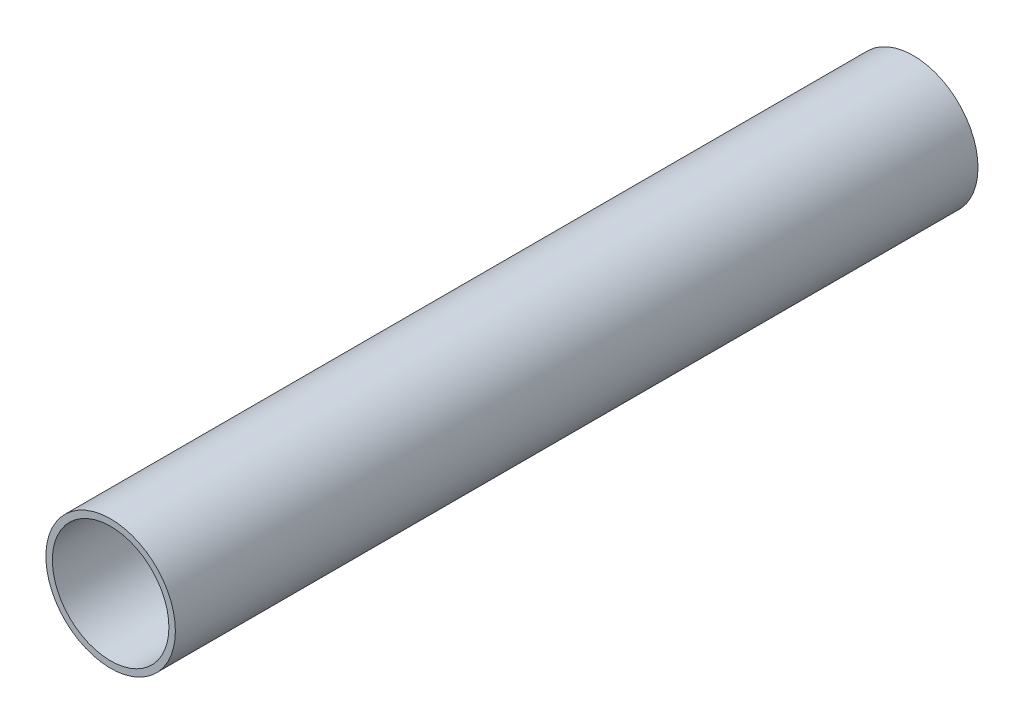
ISO-10303-21;
HEADER;
FILE_DESCRIPTION(('STEP AP214'),'2;1');
FILE_NAME('part.step','',(''),(''),'','','');
FILE_SCHEMA(('AUTOMOTIVE_DESIGN { 1 0 10303 214 1 1 1 1 }'));
ENDSEC;
DATA;
#1=APPLICATION_CONTEXT('core data for automotive mechanical design processes');
#2=APPLICATION_PROTOCOL_DEFINITION('international standard','automotive_design',2000,#1);
#3=PRODUCT_CONTEXT('',#1,'mechanical');
#4=PRODUCT('Part','Part','',(#3));
#5=PRODUCT_RELATED_PRODUCT_CATEGORY('part','',(#4));
#6=PRODUCT_DEFINITION_FORMATION('','',#4);
#7=PRODUCT_DEFINITION_CONTEXT('part definition',#1,'design');
#8=PRODUCT_DEFINITION('design','',#6,#7);
#9=PRODUCT_DEFINITION_SHAPE('','',#8);
#10=(LENGTH_UNIT() NAMED_UNIT(*) SI_UNIT(.MILLI.,.METRE.));
#11=(NAMED_UNIT(*) PLANE_ANGLE_UNIT() SI_UNIT($,.RADIAN.));
#12=(NAMED_UNIT(*) SI_UNIT($,.STERADIAN.) SOLID_ANGLE_UNIT());
#13=UNCERTAINTY_MEASURE_WITH_UNIT(LENGTH_MEASURE(1.E-05),#10,'distance_accuracy_value','');
#14=(GEOMETRIC_REPRESENTATION_CONTEXT(3) GLOBAL_UNCERTAINTY_ASSIGNED_CONTEXT((#13)) GLOBAL_UNIT_ASSIGNED_CONTEXT((#10,
#11,#12)) REPRESENTATION_CONTEXT('',''));
#15=CARTESIAN_POINT('',(0.,0.,0.));
#16=DIRECTION('',(0.,0.,1.));
#17=DIRECTION('',(1.,0.,0.));
#18=AXIS2_PLACEMENT_3D('',#15,#16,#17);
#19=CARTESIAN_POINT('',(0.,0.,15.24));
#20=DIRECTION('',(0.,0.,1.));
#21=DIRECTION('',(1.,0.,0.));
#22=AXIS2_PLACEMENT_3D('',#19,#20,#21);
#23=CYLINDRICAL_SURFACE('',#22,14.285000005);
#24=CARTESIAN_POINT('',(0.,0.,212.0000000022));
#25=DIRECTION('',(0.,0.,1.));
#26=DIRECTION('',(1.,0.,0.));
#27=AXIS2_PLACEMENT_3D('',#24,#25,#26);
#28=CIRCLE('',#27,14.285000005);
#29=CARTESIAN_POINT('',(14.285000005,0.,212.0000000022));
#30=VERTEX_POINT('',#29);
#31=EDGE_CURVE('E18',#30,#30,#28,.T.);
#32=ORIENTED_EDGE('',*,*,#31,.T.);
#33=EDGE_LOOP('',(#32));
#34=FACE_BOUND('',#33,.T.);
#35=CARTESIAN_POINT('',(0.,0.,15.24));
#36=DIRECTION('',(0.,0.,1.));
#37=DIRECTION('',(1.,0.,0.));
#38=AXIS2_PLACEMENT_3D('',#35,#36,#37);
#39=CIRCLE('',#38,14.285000005);
#40=CARTESIAN_POINT('',(14.285000005,0.,15.24));
#41=VERTEX_POINT('',#40);
#42=EDGE_CURVE('E27',#41,#41,#39,.T.);
#43=ORIENTED_EDGE('',*,*,#42,.F.);
#44=EDGE_LOOP('',(#43));
#45=FACE_BOUND('',#44,.T.);
#46=ADVANCED_FACE('F14',(#34,#45),#23,.F.);
#47=CARTESIAN_POINT('',(16.0655,-16.0655,212.0000000022));
#48=DIRECTION('',(0.,0.,-1.));
#49=DIRECTION('',(-1.,0.,0.));
#50=AXIS2_PLACEMENT_3D('',#47,#48,#49);
#51=PLANE('',#50);
#52=ORIENTED_EDGE('',*,*,#31,.F.);
#53=EDGE_LOOP('',(#52));
#54=FACE_BOUND('',#53,.T.);
#55=CARTESIAN_POINT('',(0.,0.,212.0000000022));
#56=DIRECTION('',(0.,0.,1.));
#57=DIRECTION('',(1.,0.,0.));
#58=AXIS2_PLACEMENT_3D('',#55,#56,#57);
#59=CIRCLE('',#58,15.875);
#60=CARTESIAN_POINT('',(15.875,0.,212.0000000022));
#61=VERTEX_POINT('',#60);
#62=EDGE_CURVE('E22',#61,#61,#59,.T.);
#63=ORIENTED_EDGE('',*,*,#62,.T.);
#64=EDGE_LOOP('',(#63));
#65=FACE_BOUND('',#64,.T.);
#66=ADVANCED_FACE('F37',(#54,#65),#51,.F.);
#67=CARTESIAN_POINT('',(16.0655,-16.0655,15.24));
#68=DIRECTION('',(0.,0.,-1.));
#69=DIRECTION('',(-1.,0.,0.));
#70=AXIS2_PLACEMENT_3D('',#67,#68,#69);
#71=PLANE('',#70);
#72=ORIENTED_EDGE('',*,*,#42,.T.);
#73=EDGE_LOOP('',(#72));
#74=FACE_BOUND('',#73,.T.);
#75=CARTESIAN_POINT('',(0.,0.,15.24));
#76=DIRECTION('',(0.,0.,1.));
#77=DIRECTION('',(1.,0.,0.));
#78=AXIS2_PLACEMENT_3D('',#75,#76,#77);
#79=CIRCLE('',#78,15.875);
#80=CARTESIAN_POINT('',(15.875,0.,15.24));
#81=VERTEX_POINT('',#80);
#82=EDGE_CURVE('E10',#81,#81,#79,.F.);
#83=ORIENTED_EDGE('',*,*,#82,.T.);
#84=EDGE_LOOP('',(#83));
#85=FACE_BOUND('',#84,.T.);
#86=ADVANCED_FACE('F16',(#74,#85),#71,.T.);
#87=CARTESIAN_POINT('',(0.,0.,15.24));
#88=DIRECTION('',(0.,0.,1.));
#89=DIRECTION('',(1.,0.,0.));
#90=AXIS2_PLACEMENT_3D('',#87,#88,#89);
#91=CYLINDRICAL_SURFACE('',#90,15.875);
#92=ORIENTED_EDGE('',*,*,#62,.F.);
#93=EDGE_LOOP('',(#92));
#94=FACE_BOUND('',#93,.T.);
#95=ORIENTED_EDGE('',*,*,#82,.F.);
#96=EDGE_LOOP('',(#95));
#97=FACE_BOUND('',#96,.T.);
#98=ADVANCED_FACE('F42',(#94,#97),#91,.T.);
#99=CLOSED_SHELL('',(#46,#66,#86,#98));
#100=MANIFOLD_SOLID_BREP('B1',#99);
#101=ADVANCED_BREP_SHAPE_REPRESENTATION('',(#18,#100),#14);
#102=SHAPE_DEFINITION_REPRESENTATION(#9,#101);
ENDSEC;
END-ISO-10303-21;
